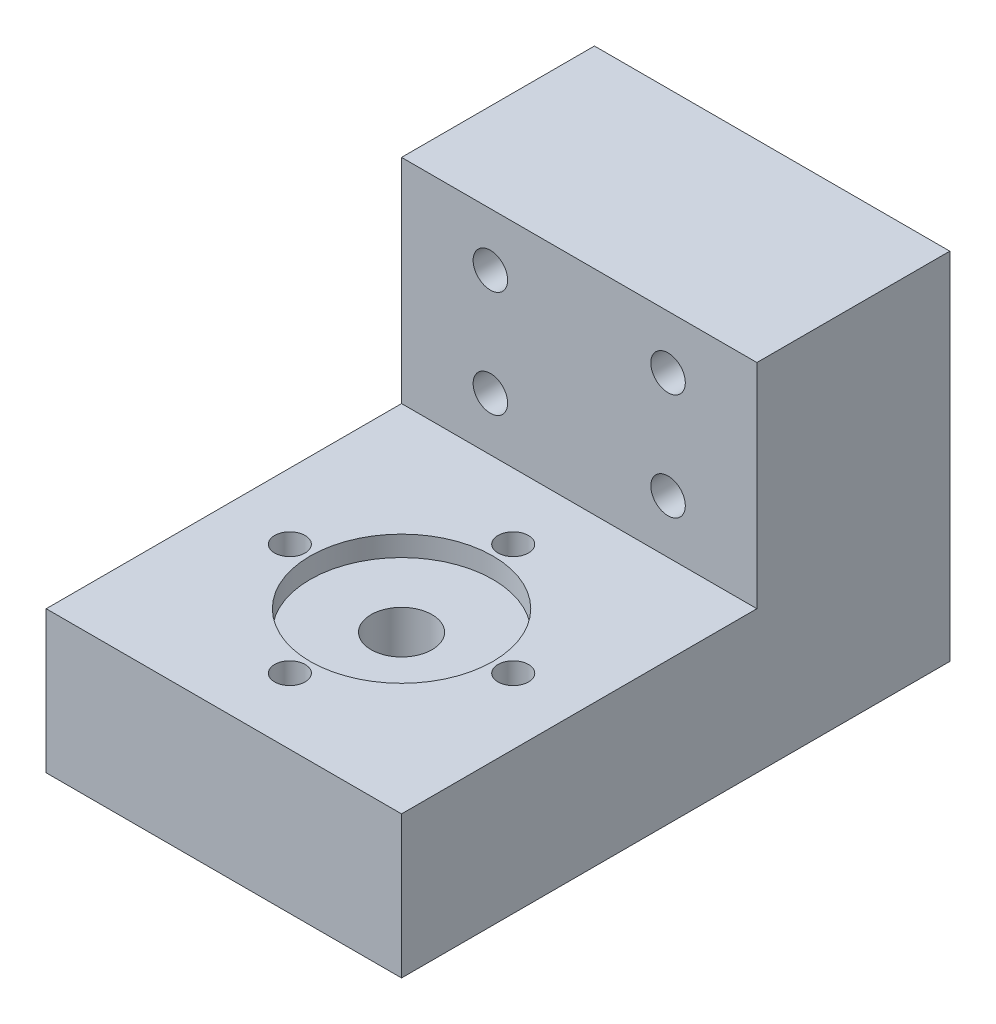
ISO-10303-21;
HEADER;
FILE_DESCRIPTION(('STEP AP214'),'2;1');
FILE_NAME('part.step','',(''),(''),'','','');
FILE_SCHEMA(('AUTOMOTIVE_DESIGN { 1 0 10303 214 1 1 1 1 }'));
ENDSEC;
DATA;
#1=APPLICATION_CONTEXT('core data for automotive mechanical design processes');
#2=APPLICATION_PROTOCOL_DEFINITION('international standard','automotive_design',2000,#1);
#3=PRODUCT_CONTEXT('',#1,'mechanical');
#4=PRODUCT('Part','Part','',(#3));
#5=PRODUCT_RELATED_PRODUCT_CATEGORY('part','',(#4));
#6=PRODUCT_DEFINITION_FORMATION('','',#4);
#7=PRODUCT_DEFINITION_CONTEXT('part definition',#1,'design');
#8=PRODUCT_DEFINITION('design','',#6,#7);
#9=PRODUCT_DEFINITION_SHAPE('','',#8);
#10=(LENGTH_UNIT() NAMED_UNIT(*) SI_UNIT(.MILLI.,.METRE.));
#11=(NAMED_UNIT(*) PLANE_ANGLE_UNIT() SI_UNIT($,.RADIAN.));
#12=(NAMED_UNIT(*) SI_UNIT($,.STERADIAN.) SOLID_ANGLE_UNIT());
#13=UNCERTAINTY_MEASURE_WITH_UNIT(LENGTH_MEASURE(1.E-05),#10,'distance_accuracy_value','');
#14=(GEOMETRIC_REPRESENTATION_CONTEXT(3) GLOBAL_UNCERTAINTY_ASSIGNED_CONTEXT((#13)) GLOBAL_UNIT_ASSIGNED_CONTEXT((#10,
#11,#12)) REPRESENTATION_CONTEXT('',''));
#15=CARTESIAN_POINT('',(0.,0.,0.));
#16=DIRECTION('',(0.,0.,1.));
#17=DIRECTION('',(1.,0.,0.));
#18=AXIS2_PLACEMENT_3D('',#15,#16,#17);
#19=CARTESIAN_POINT('',(17.5,0.,36.5));
#20=DIRECTION('',(0.,1.,0.));
#21=DIRECTION('',(0.,0.,1.));
#22=AXIS2_PLACEMENT_3D('',#19,#20,#21);
#23=CYLINDRICAL_SURFACE('',#22,3.);
#24=CARTESIAN_POINT('',(17.5,0.,36.5));
#25=DIRECTION('',(0.,1.,0.));
#26=DIRECTION('',(0.,0.,1.));
#27=AXIS2_PLACEMENT_3D('',#24,#25,#26);
#28=CIRCLE('',#27,3.);
#29=CARTESIAN_POINT('',(17.5,0.,39.5));
#30=VERTEX_POINT('',#29);
#31=EDGE_CURVE('E134',#30,#30,#28,.T.);
#32=ORIENTED_EDGE('',*,*,#31,.F.);
#33=EDGE_LOOP('',(#32));
#34=FACE_BOUND('',#33,.T.);
#35=CARTESIAN_POINT('',(17.5,12.,36.5));
#36=DIRECTION('',(0.,1.,0.));
#37=DIRECTION('',(0.,0.,1.));
#38=AXIS2_PLACEMENT_3D('',#35,#36,#37);
#39=CIRCLE('',#38,3.);
#40=CARTESIAN_POINT('',(17.5,12.,39.5));
#41=VERTEX_POINT('',#40);
#42=EDGE_CURVE('E49',#41,#41,#39,.F.);
#43=ORIENTED_EDGE('',*,*,#42,.F.);
#44=EDGE_LOOP('',(#43));
#45=FACE_BOUND('',#44,.T.);
#46=ADVANCED_FACE('F45',(#34,#45),#23,.F.);
#47=CARTESIAN_POINT('',(0.,0.,19.));
#48=DIRECTION('',(0.,0.,-1.));
#49=DIRECTION('',(-1.,0.,0.));
#50=AXIS2_PLACEMENT_3D('',#47,#48,#49);
#51=PLANE('',#50);
#52=CARTESIAN_POINT('',(26.25,29.75,19.));
#53=DIRECTION('',(0.,0.,1.));
#54=DIRECTION('',(1.,0.,0.));
#55=AXIS2_PLACEMENT_3D('',#52,#53,#54);
#56=CIRCLE('',#55,1.7);
#57=CARTESIAN_POINT('',(27.95,29.75,19.));
#58=VERTEX_POINT('',#57);
#59=EDGE_CURVE('E178',#58,#58,#56,.T.);
#60=ORIENTED_EDGE('',*,*,#59,.F.);
#61=EDGE_LOOP('',(#60));
#62=FACE_BOUND('',#61,.T.);
#63=CARTESIAN_POINT('',(8.75,19.25,19.));
#64=DIRECTION('',(0.,0.,1.));
#65=DIRECTION('',(1.,0.,0.));
#66=AXIS2_PLACEMENT_3D('',#63,#64,#65);
#67=CIRCLE('',#66,1.7);
#68=CARTESIAN_POINT('',(10.45,19.25,19.));
#69=VERTEX_POINT('',#68);
#70=EDGE_CURVE('E184',#69,#69,#67,.T.);
#71=ORIENTED_EDGE('',*,*,#70,.F.);
#72=EDGE_LOOP('',(#71));
#73=FACE_BOUND('',#72,.T.);
#74=CARTESIAN_POINT('',(26.25,19.25,19.));
#75=DIRECTION('',(0.,0.,1.));
#76=DIRECTION('',(1.,0.,0.));
#77=AXIS2_PLACEMENT_3D('',#74,#75,#76);
#78=CIRCLE('',#77,1.7);
#79=CARTESIAN_POINT('',(27.95,19.25,19.));
#80=VERTEX_POINT('',#79);
#81=EDGE_CURVE('E185',#80,#80,#78,.T.);
#82=ORIENTED_EDGE('',*,*,#81,.F.);
#83=EDGE_LOOP('',(#82));
#84=FACE_BOUND('',#83,.T.);
#85=CARTESIAN_POINT('',(8.75,29.75,19.));
#86=DIRECTION('',(0.,0.,1.));
#87=DIRECTION('',(1.,0.,0.));
#88=AXIS2_PLACEMENT_3D('',#85,#86,#87);
#89=CIRCLE('',#88,1.7);
#90=CARTESIAN_POINT('',(10.45,29.75,19.));
#91=VERTEX_POINT('',#90);
#92=EDGE_CURVE('E175',#91,#91,#89,.T.);
#93=ORIENTED_EDGE('',*,*,#92,.F.);
#94=EDGE_LOOP('',(#93));
#95=FACE_BOUND('',#94,.T.);
#96=DIRECTION('',(-1.,0.,0.));
#97=VECTOR('',#96,1.);
#98=CARTESIAN_POINT('',(0.,14.,19.));
#99=LINE('',#98,#97);
#100=CARTESIAN_POINT('',(35.,14.,19.));
#101=VERTEX_POINT('',#100);
#102=CARTESIAN_POINT('',(0.,14.,19.));
#103=VERTEX_POINT('',#102);
#104=EDGE_CURVE('E62',#101,#103,#99,.T.);
#105=ORIENTED_EDGE('',*,*,#104,.F.);
#106=DIRECTION('',(0.,1.,0.));
#107=VECTOR('',#106,1.);
#108=CARTESIAN_POINT('',(35.,0.,19.));
#109=LINE('',#108,#107);
#110=CARTESIAN_POINT('',(35.,35.,19.));
#111=VERTEX_POINT('',#110);
#112=EDGE_CURVE('E67',#101,#111,#109,.T.);
#113=ORIENTED_EDGE('',*,*,#112,.T.);
#114=DIRECTION('',(1.,0.,0.));
#115=VECTOR('',#114,1.);
#116=CARTESIAN_POINT('',(0.,35.,19.));
#117=LINE('',#116,#115);
#118=CARTESIAN_POINT('',(0.,35.,19.));
#119=VERTEX_POINT('',#118);
#120=EDGE_CURVE('E124',#119,#111,#117,.T.);
#121=ORIENTED_EDGE('',*,*,#120,.F.);
#122=DIRECTION('',(0.,1.,0.));
#123=VECTOR('',#122,1.);
#124=CARTESIAN_POINT('',(0.,0.,19.));
#125=LINE('',#124,#123);
#126=EDGE_CURVE('E106',#103,#119,#125,.T.);
#127=ORIENTED_EDGE('',*,*,#126,.F.);
#128=EDGE_LOOP('',(#105,#113,#121,#127));
#129=FACE_BOUND('',#128,.T.);
#130=ADVANCED_FACE('F201',(#62,#73,#84,#95,#129),#51,.F.);
#131=CARTESIAN_POINT('',(0.,0.,19.));
#132=DIRECTION('',(-1.,0.,0.));
#133=DIRECTION('',(0.,0.,1.));
#134=AXIS2_PLACEMENT_3D('',#131,#132,#133);
#135=PLANE('',#134);
#136=DIRECTION('',(0.,1.,0.));
#137=VECTOR('',#136,1.);
#138=CARTESIAN_POINT('',(0.,0.,0.));
#139=LINE('',#138,#137);
#140=CARTESIAN_POINT('',(0.,0.,0.));
#141=VERTEX_POINT('',#140);
#142=CARTESIAN_POINT('',(0.,35.,0.));
#143=VERTEX_POINT('',#142);
#144=EDGE_CURVE('E103',#141,#143,#139,.T.);
#145=ORIENTED_EDGE('',*,*,#144,.F.);
#146=DIRECTION('',(0.,0.,-1.));
#147=VECTOR('',#146,1.);
#148=CARTESIAN_POINT('',(0.,0.,19.));
#149=LINE('',#148,#147);
#150=CARTESIAN_POINT('',(0.,0.,54.));
#151=VERTEX_POINT('',#150);
#152=EDGE_CURVE('E11',#151,#141,#149,.T.);
#153=ORIENTED_EDGE('',*,*,#152,.F.);
#154=DIRECTION('',(0.,-1.,0.));
#155=VECTOR('',#154,1.);
#156=CARTESIAN_POINT('',(0.,0.,54.));
#157=LINE('',#156,#155);
#158=CARTESIAN_POINT('',(0.,14.,54.));
#159=VERTEX_POINT('',#158);
#160=EDGE_CURVE('E133',#159,#151,#157,.T.);
#161=ORIENTED_EDGE('',*,*,#160,.F.);
#162=DIRECTION('',(0.,0.,-1.));
#163=VECTOR('',#162,1.);
#164=CARTESIAN_POINT('',(0.,14.,54.));
#165=LINE('',#164,#163);
#166=EDGE_CURVE('E116',#159,#103,#165,.T.);
#167=ORIENTED_EDGE('',*,*,#166,.T.);
#168=ORIENTED_EDGE('',*,*,#126,.T.);
#169=DIRECTION('',(0.,0.,-1.));
#170=VECTOR('',#169,1.);
#171=CARTESIAN_POINT('',(0.,35.,19.));
#172=LINE('',#171,#170);
#173=EDGE_CURVE('E109',#119,#143,#172,.T.);
#174=ORIENTED_EDGE('',*,*,#173,.T.);
#175=EDGE_LOOP('',(#145,#153,#161,#167,#168,#174));
#176=FACE_BOUND('',#175,.T.);
#177=ADVANCED_FACE('F47',(#176),#135,.T.);
#178=CARTESIAN_POINT('',(0.,0.,19.));
#179=DIRECTION('',(0.,1.,0.));
#180=DIRECTION('',(0.,0.,1.));
#181=AXIS2_PLACEMENT_3D('',#178,#179,#180);
#182=PLANE('',#181);
#183=CARTESIAN_POINT('',(6.5,0.,36.5));
#184=DIRECTION('',(0.,1.,0.));
#185=DIRECTION('',(0.,0.,1.));
#186=AXIS2_PLACEMENT_3D('',#183,#184,#185);
#187=CIRCLE('',#186,1.5);
#188=CARTESIAN_POINT('',(6.5,0.,38.));
#189=VERTEX_POINT('',#188);
#190=EDGE_CURVE('E148',#189,#189,#187,.T.);
#191=ORIENTED_EDGE('',*,*,#190,.T.);
#192=EDGE_LOOP('',(#191));
#193=FACE_BOUND('',#192,.T.);
#194=CARTESIAN_POINT('',(17.5,0.,25.5));
#195=DIRECTION('',(0.,1.,0.));
#196=DIRECTION('',(0.,0.,1.));
#197=AXIS2_PLACEMENT_3D('',#194,#195,#196);
#198=CIRCLE('',#197,1.5);
#199=CARTESIAN_POINT('',(17.5,0.,27.));
#200=VERTEX_POINT('',#199);
#201=EDGE_CURVE('E164',#200,#200,#198,.T.);
#202=ORIENTED_EDGE('',*,*,#201,.T.);
#203=EDGE_LOOP('',(#202));
#204=FACE_BOUND('',#203,.T.);
#205=CARTESIAN_POINT('',(28.5,0.,36.5));
#206=DIRECTION('',(0.,1.,0.));
#207=DIRECTION('',(0.,0.,1.));
#208=AXIS2_PLACEMENT_3D('',#205,#206,#207);
#209=CIRCLE('',#208,1.5);
#210=CARTESIAN_POINT('',(28.5,0.,38.));
#211=VERTEX_POINT('',#210);
#212=EDGE_CURVE('E158',#211,#211,#209,.T.);
#213=ORIENTED_EDGE('',*,*,#212,.T.);
#214=EDGE_LOOP('',(#213));
#215=FACE_BOUND('',#214,.T.);
#216=CARTESIAN_POINT('',(17.5,0.,47.5));
#217=DIRECTION('',(0.,1.,0.));
#218=DIRECTION('',(0.,0.,1.));
#219=AXIS2_PLACEMENT_3D('',#216,#217,#218);
#220=CIRCLE('',#219,1.5);
#221=CARTESIAN_POINT('',(17.5,0.,49.));
#222=VERTEX_POINT('',#221);
#223=EDGE_CURVE('E151',#222,#222,#220,.T.);
#224=ORIENTED_EDGE('',*,*,#223,.T.);
#225=EDGE_LOOP('',(#224));
#226=FACE_BOUND('',#225,.T.);
#227=ORIENTED_EDGE('',*,*,#31,.T.);
#228=EDGE_LOOP('',(#227));
#229=FACE_BOUND('',#228,.T.);
#230=DIRECTION('',(1.,0.,0.));
#231=VECTOR('',#230,1.);
#232=CARTESIAN_POINT('',(0.,0.,0.));
#233=LINE('',#232,#231);
#234=CARTESIAN_POINT('',(35.,0.,0.));
#235=VERTEX_POINT('',#234);
#236=EDGE_CURVE('E89',#141,#235,#233,.T.);
#237=ORIENTED_EDGE('',*,*,#236,.T.);
#238=DIRECTION('',(0.,0.,-1.));
#239=VECTOR('',#238,1.);
#240=CARTESIAN_POINT('',(35.,0.,19.));
#241=LINE('',#240,#239);
#242=CARTESIAN_POINT('',(35.,0.,54.));
#243=VERTEX_POINT('',#242);
#244=EDGE_CURVE('E54',#243,#235,#241,.T.);
#245=ORIENTED_EDGE('',*,*,#244,.F.);
#246=DIRECTION('',(1.,0.,0.));
#247=VECTOR('',#246,1.);
#248=CARTESIAN_POINT('',(0.,0.,54.));
#249=LINE('',#248,#247);
#250=EDGE_CURVE('E93',#151,#243,#249,.T.);
#251=ORIENTED_EDGE('',*,*,#250,.F.);
#252=ORIENTED_EDGE('',*,*,#152,.T.);
#253=EDGE_LOOP('',(#237,#245,#251,#252));
#254=FACE_BOUND('',#253,.T.);
#255=ADVANCED_FACE('F87',(#193,#204,#215,#226,#229,#254),#182,.F.);
#256=CARTESIAN_POINT('',(35.,0.,19.));
#257=DIRECTION('',(-1.,0.,0.));
#258=DIRECTION('',(0.,0.,1.));
#259=AXIS2_PLACEMENT_3D('',#256,#257,#258);
#260=PLANE('',#259);
#261=DIRECTION('',(0.,1.,0.));
#262=VECTOR('',#261,1.);
#263=CARTESIAN_POINT('',(35.,0.,0.));
#264=LINE('',#263,#262);
#265=CARTESIAN_POINT('',(35.,35.,0.));
#266=VERTEX_POINT('',#265);
#267=EDGE_CURVE('E105',#235,#266,#264,.T.);
#268=ORIENTED_EDGE('',*,*,#267,.T.);
#269=DIRECTION('',(0.,0.,-1.));
#270=VECTOR('',#269,1.);
#271=CARTESIAN_POINT('',(35.,35.,19.));
#272=LINE('',#271,#270);
#273=EDGE_CURVE('E123',#111,#266,#272,.T.);
#274=ORIENTED_EDGE('',*,*,#273,.F.);
#275=ORIENTED_EDGE('',*,*,#112,.F.);
#276=DIRECTION('',(0.,0.,-1.));
#277=VECTOR('',#276,1.);
#278=CARTESIAN_POINT('',(35.,14.,54.));
#279=LINE('',#278,#277);
#280=CARTESIAN_POINT('',(35.,14.,54.));
#281=VERTEX_POINT('',#280);
#282=EDGE_CURVE('E112',#281,#101,#279,.T.);
#283=ORIENTED_EDGE('',*,*,#282,.F.);
#284=DIRECTION('',(0.,1.,0.));
#285=VECTOR('',#284,1.);
#286=CARTESIAN_POINT('',(35.,0.,54.));
#287=LINE('',#286,#285);
#288=EDGE_CURVE('E137',#243,#281,#287,.T.);
#289=ORIENTED_EDGE('',*,*,#288,.F.);
#290=ORIENTED_EDGE('',*,*,#244,.T.);
#291=EDGE_LOOP('',(#268,#274,#275,#283,#289,#290));
#292=FACE_BOUND('',#291,.T.);
#293=ADVANCED_FACE('F252',(#292),#260,.F.);
#294=CARTESIAN_POINT('',(0.,35.,19.));
#295=DIRECTION('',(0.,1.,0.));
#296=DIRECTION('',(0.,0.,1.));
#297=AXIS2_PLACEMENT_3D('',#294,#295,#296);
#298=PLANE('',#297);
#299=DIRECTION('',(1.,0.,0.));
#300=VECTOR('',#299,1.);
#301=CARTESIAN_POINT('',(0.,35.,0.));
#302=LINE('',#301,#300);
#303=EDGE_CURVE('E111',#143,#266,#302,.T.);
#304=ORIENTED_EDGE('',*,*,#303,.F.);
#305=ORIENTED_EDGE('',*,*,#173,.F.);
#306=ORIENTED_EDGE('',*,*,#120,.T.);
#307=ORIENTED_EDGE('',*,*,#273,.T.);
#308=EDGE_LOOP('',(#304,#305,#306,#307));
#309=FACE_BOUND('',#308,.T.);
#310=ADVANCED_FACE('F248',(#309),#298,.T.);
#311=CARTESIAN_POINT('',(0.,0.,0.));
#312=DIRECTION('',(0.,0.,-1.));
#313=DIRECTION('',(-1.,0.,0.));
#314=AXIS2_PLACEMENT_3D('',#311,#312,#313);
#315=PLANE('',#314);
#316=CARTESIAN_POINT('',(26.25,29.75,0.));
#317=DIRECTION('',(0.,0.,1.));
#318=DIRECTION('',(1.,0.,0.));
#319=AXIS2_PLACEMENT_3D('',#316,#317,#318);
#320=CIRCLE('',#319,1.7);
#321=CARTESIAN_POINT('',(27.95,29.75,0.));
#322=VERTEX_POINT('',#321);
#323=EDGE_CURVE('E188',#322,#322,#320,.T.);
#324=ORIENTED_EDGE('',*,*,#323,.T.);
#325=EDGE_LOOP('',(#324));
#326=FACE_BOUND('',#325,.T.);
#327=CARTESIAN_POINT('',(8.75,19.25,0.));
#328=DIRECTION('',(0.,0.,1.));
#329=DIRECTION('',(1.,0.,0.));
#330=AXIS2_PLACEMENT_3D('',#327,#328,#329);
#331=CIRCLE('',#330,1.7);
#332=CARTESIAN_POINT('',(10.45,19.25,0.));
#333=VERTEX_POINT('',#332);
#334=EDGE_CURVE('E181',#333,#333,#331,.T.);
#335=ORIENTED_EDGE('',*,*,#334,.T.);
#336=EDGE_LOOP('',(#335));
#337=FACE_BOUND('',#336,.T.);
#338=CARTESIAN_POINT('',(26.25,19.25,0.));
#339=DIRECTION('',(0.,0.,1.));
#340=DIRECTION('',(1.,0.,0.));
#341=AXIS2_PLACEMENT_3D('',#338,#339,#340);
#342=CIRCLE('',#341,1.7);
#343=CARTESIAN_POINT('',(27.95,19.25,0.));
#344=VERTEX_POINT('',#343);
#345=EDGE_CURVE('E193',#344,#344,#342,.T.);
#346=ORIENTED_EDGE('',*,*,#345,.T.);
#347=EDGE_LOOP('',(#346));
#348=FACE_BOUND('',#347,.T.);
#349=CARTESIAN_POINT('',(8.75,29.75,0.));
#350=DIRECTION('',(0.,0.,1.));
#351=DIRECTION('',(1.,0.,0.));
#352=AXIS2_PLACEMENT_3D('',#349,#350,#351);
#353=CIRCLE('',#352,1.7);
#354=CARTESIAN_POINT('',(10.45,29.75,0.));
#355=VERTEX_POINT('',#354);
#356=EDGE_CURVE('E155',#355,#355,#353,.T.);
#357=ORIENTED_EDGE('',*,*,#356,.T.);
#358=EDGE_LOOP('',(#357));
#359=FACE_BOUND('',#358,.T.);
#360=ORIENTED_EDGE('',*,*,#144,.T.);
#361=ORIENTED_EDGE('',*,*,#303,.T.);
#362=ORIENTED_EDGE('',*,*,#267,.F.);
#363=ORIENTED_EDGE('',*,*,#236,.F.);
#364=EDGE_LOOP('',(#360,#361,#362,#363));
#365=FACE_BOUND('',#364,.T.);
#366=ADVANCED_FACE('F101',(#326,#337,#348,#359,#365),#315,.T.);
#367=CARTESIAN_POINT('',(0.,14.,54.));
#368=DIRECTION('',(0.,-1.,0.));
#369=DIRECTION('',(0.,0.,-1.));
#370=AXIS2_PLACEMENT_3D('',#367,#368,#369);
#371=PLANE('',#370);
#372=CARTESIAN_POINT('',(6.5,14.,36.5));
#373=DIRECTION('',(0.,1.,0.));
#374=DIRECTION('',(0.,0.,1.));
#375=AXIS2_PLACEMENT_3D('',#372,#373,#374);
#376=CIRCLE('',#375,1.5);
#377=CARTESIAN_POINT('',(6.5,14.,38.));
#378=VERTEX_POINT('',#377);
#379=EDGE_CURVE('E170',#378,#378,#376,.T.);
#380=ORIENTED_EDGE('',*,*,#379,.F.);
#381=EDGE_LOOP('',(#380));
#382=FACE_BOUND('',#381,.T.);
#383=CARTESIAN_POINT('',(17.5,14.,25.5));
#384=DIRECTION('',(0.,1.,0.));
#385=DIRECTION('',(0.,0.,1.));
#386=AXIS2_PLACEMENT_3D('',#383,#384,#385);
#387=CIRCLE('',#386,1.5);
#388=CARTESIAN_POINT('',(17.5,14.,27.));
#389=VERTEX_POINT('',#388);
#390=EDGE_CURVE('E167',#389,#389,#387,.T.);
#391=ORIENTED_EDGE('',*,*,#390,.F.);
#392=EDGE_LOOP('',(#391));
#393=FACE_BOUND('',#392,.T.);
#394=CARTESIAN_POINT('',(28.5,14.,36.5));
#395=DIRECTION('',(0.,1.,0.));
#396=DIRECTION('',(0.,0.,1.));
#397=AXIS2_PLACEMENT_3D('',#394,#395,#396);
#398=CIRCLE('',#397,1.5);
#399=CARTESIAN_POINT('',(28.5,14.,38.));
#400=VERTEX_POINT('',#399);
#401=EDGE_CURVE('E161',#400,#400,#398,.T.);
#402=ORIENTED_EDGE('',*,*,#401,.F.);
#403=EDGE_LOOP('',(#402));
#404=FACE_BOUND('',#403,.T.);
#405=CARTESIAN_POINT('',(17.5,14.,47.5));
#406=DIRECTION('',(0.,1.,0.));
#407=DIRECTION('',(0.,0.,1.));
#408=AXIS2_PLACEMENT_3D('',#405,#406,#407);
#409=CIRCLE('',#408,1.5);
#410=CARTESIAN_POINT('',(17.5,14.,49.));
#411=VERTEX_POINT('',#410);
#412=EDGE_CURVE('E154',#411,#411,#409,.T.);
#413=ORIENTED_EDGE('',*,*,#412,.F.);
#414=EDGE_LOOP('',(#413));
#415=FACE_BOUND('',#414,.T.);
#416=CARTESIAN_POINT('',(17.5,14.,36.5));
#417=DIRECTION('',(0.,1.,0.));
#418=DIRECTION('',(0.,0.,1.));
#419=AXIS2_PLACEMENT_3D('',#416,#417,#418);
#420=CIRCLE('',#419,9.);
#421=CARTESIAN_POINT('',(17.5,14.,45.5));
#422=VERTEX_POINT('',#421);
#423=EDGE_CURVE('E144',#422,#422,#420,.T.);
#424=ORIENTED_EDGE('',*,*,#423,.F.);
#425=EDGE_LOOP('',(#424));
#426=FACE_BOUND('',#425,.T.);
#427=ORIENTED_EDGE('',*,*,#104,.T.);
#428=ORIENTED_EDGE('',*,*,#166,.F.);
#429=DIRECTION('',(-1.,0.,0.));
#430=VECTOR('',#429,1.);
#431=CARTESIAN_POINT('',(0.,14.,54.));
#432=LINE('',#431,#430);
#433=EDGE_CURVE('E131',#281,#159,#432,.T.);
#434=ORIENTED_EDGE('',*,*,#433,.F.);
#435=ORIENTED_EDGE('',*,*,#282,.T.);
#436=EDGE_LOOP('',(#427,#428,#434,#435));
#437=FACE_BOUND('',#436,.T.);
#438=ADVANCED_FACE('F242',(#382,#393,#404,#415,#426,#437),#371,.F.);
#439=CARTESIAN_POINT('',(0.,0.,54.));
#440=DIRECTION('',(0.,0.,-1.));
#441=DIRECTION('',(-1.,0.,0.));
#442=AXIS2_PLACEMENT_3D('',#439,#440,#441);
#443=PLANE('',#442);
#444=ORIENTED_EDGE('',*,*,#160,.T.);
#445=ORIENTED_EDGE('',*,*,#250,.T.);
#446=ORIENTED_EDGE('',*,*,#288,.T.);
#447=ORIENTED_EDGE('',*,*,#433,.T.);
#448=EDGE_LOOP('',(#444,#445,#446,#447));
#449=FACE_BOUND('',#448,.T.);
#450=ADVANCED_FACE('F239',(#449),#443,.F.);
#451=CARTESIAN_POINT('',(17.5,12.,36.5));
#452=DIRECTION('',(0.,1.,0.));
#453=DIRECTION('',(0.,0.,1.));
#454=AXIS2_PLACEMENT_3D('',#451,#452,#453);
#455=PLANE('',#454);
#456=CARTESIAN_POINT('',(17.5,12.,36.5));
#457=DIRECTION('',(0.,1.,0.));
#458=DIRECTION('',(0.,0.,1.));
#459=AXIS2_PLACEMENT_3D('',#456,#457,#458);
#460=CIRCLE('',#459,9.);
#461=CARTESIAN_POINT('',(17.5,12.,45.5));
#462=VERTEX_POINT('',#461);
#463=EDGE_CURVE('E147',#462,#462,#460,.T.);
#464=ORIENTED_EDGE('',*,*,#463,.T.);
#465=EDGE_LOOP('',(#464));
#466=FACE_BOUND('',#465,.T.);
#467=ORIENTED_EDGE('',*,*,#42,.T.);
#468=EDGE_LOOP('',(#467));
#469=FACE_BOUND('',#468,.T.);
#470=ADVANCED_FACE('F241',(#466,#469),#455,.T.);
#471=CARTESIAN_POINT('',(17.5,12.,36.5));
#472=DIRECTION('',(0.,1.,0.));
#473=DIRECTION('',(0.,0.,1.));
#474=AXIS2_PLACEMENT_3D('',#471,#472,#473);
#475=CYLINDRICAL_SURFACE('',#474,9.);
#476=ORIENTED_EDGE('',*,*,#463,.F.);
#477=EDGE_LOOP('',(#476));
#478=FACE_BOUND('',#477,.T.);
#479=ORIENTED_EDGE('',*,*,#423,.T.);
#480=EDGE_LOOP('',(#479));
#481=FACE_BOUND('',#480,.T.);
#482=ADVANCED_FACE('F237',(#478,#481),#475,.F.);
#483=CARTESIAN_POINT('',(17.5,0.,47.5));
#484=DIRECTION('',(0.,1.,0.));
#485=DIRECTION('',(0.,0.,1.));
#486=AXIS2_PLACEMENT_3D('',#483,#484,#485);
#487=CYLINDRICAL_SURFACE('',#486,1.5);
#488=ORIENTED_EDGE('',*,*,#223,.F.);
#489=EDGE_LOOP('',(#488));
#490=FACE_BOUND('',#489,.T.);
#491=ORIENTED_EDGE('',*,*,#412,.T.);
#492=EDGE_LOOP('',(#491));
#493=FACE_BOUND('',#492,.T.);
#494=ADVANCED_FACE('F315',(#490,#493),#487,.F.);
#495=CARTESIAN_POINT('',(28.5,0.,36.5));
#496=DIRECTION('',(0.,1.,0.));
#497=DIRECTION('',(0.,0.,1.));
#498=AXIS2_PLACEMENT_3D('',#495,#496,#497);
#499=CYLINDRICAL_SURFACE('',#498,1.5);
#500=ORIENTED_EDGE('',*,*,#212,.F.);
#501=EDGE_LOOP('',(#500));
#502=FACE_BOUND('',#501,.T.);
#503=ORIENTED_EDGE('',*,*,#401,.T.);
#504=EDGE_LOOP('',(#503));
#505=FACE_BOUND('',#504,.T.);
#506=ADVANCED_FACE('F324',(#502,#505),#499,.F.);
#507=CARTESIAN_POINT('',(17.5,0.,25.5));
#508=DIRECTION('',(0.,1.,0.));
#509=DIRECTION('',(0.,0.,1.));
#510=AXIS2_PLACEMENT_3D('',#507,#508,#509);
#511=CYLINDRICAL_SURFACE('',#510,1.5);
#512=ORIENTED_EDGE('',*,*,#201,.F.);
#513=EDGE_LOOP('',(#512));
#514=FACE_BOUND('',#513,.T.);
#515=ORIENTED_EDGE('',*,*,#390,.T.);
#516=EDGE_LOOP('',(#515));
#517=FACE_BOUND('',#516,.T.);
#518=ADVANCED_FACE('F221',(#514,#517),#511,.F.);
#519=CARTESIAN_POINT('',(6.5,0.,36.5));
#520=DIRECTION('',(0.,1.,0.));
#521=DIRECTION('',(0.,0.,1.));
#522=AXIS2_PLACEMENT_3D('',#519,#520,#521);
#523=CYLINDRICAL_SURFACE('',#522,1.5);
#524=ORIENTED_EDGE('',*,*,#190,.F.);
#525=EDGE_LOOP('',(#524));
#526=FACE_BOUND('',#525,.T.);
#527=ORIENTED_EDGE('',*,*,#379,.T.);
#528=EDGE_LOOP('',(#527));
#529=FACE_BOUND('',#528,.T.);
#530=ADVANCED_FACE('F210',(#526,#529),#523,.F.);
#531=CARTESIAN_POINT('',(8.75,29.75,0.));
#532=DIRECTION('',(0.,0.,1.));
#533=DIRECTION('',(1.,0.,0.));
#534=AXIS2_PLACEMENT_3D('',#531,#532,#533);
#535=CYLINDRICAL_SURFACE('',#534,1.7);
#536=ORIENTED_EDGE('',*,*,#356,.F.);
#537=EDGE_LOOP('',(#536));
#538=FACE_BOUND('',#537,.T.);
#539=ORIENTED_EDGE('',*,*,#92,.T.);
#540=EDGE_LOOP('',(#539));
#541=FACE_BOUND('',#540,.T.);
#542=ADVANCED_FACE('F208',(#538,#541),#535,.F.);
#543=CARTESIAN_POINT('',(26.25,19.25,0.));
#544=DIRECTION('',(0.,0.,1.));
#545=DIRECTION('',(1.,0.,0.));
#546=AXIS2_PLACEMENT_3D('',#543,#544,#545);
#547=CYLINDRICAL_SURFACE('',#546,1.7);
#548=ORIENTED_EDGE('',*,*,#345,.F.);
#549=EDGE_LOOP('',(#548));
#550=FACE_BOUND('',#549,.T.);
#551=ORIENTED_EDGE('',*,*,#81,.T.);
#552=EDGE_LOOP('',(#551));
#553=FACE_BOUND('',#552,.T.);
#554=ADVANCED_FACE('F199',(#550,#553),#547,.F.);
#555=CARTESIAN_POINT('',(8.75,19.25,0.));
#556=DIRECTION('',(0.,0.,1.));
#557=DIRECTION('',(1.,0.,0.));
#558=AXIS2_PLACEMENT_3D('',#555,#556,#557);
#559=CYLINDRICAL_SURFACE('',#558,1.7);
#560=ORIENTED_EDGE('',*,*,#334,.F.);
#561=EDGE_LOOP('',(#560));
#562=FACE_BOUND('',#561,.T.);
#563=ORIENTED_EDGE('',*,*,#70,.T.);
#564=EDGE_LOOP('',(#563));
#565=FACE_BOUND('',#564,.T.);
#566=ADVANCED_FACE('F217',(#562,#565),#559,.F.);
#567=CARTESIAN_POINT('',(26.25,29.75,0.));
#568=DIRECTION('',(0.,0.,1.));
#569=DIRECTION('',(1.,0.,0.));
#570=AXIS2_PLACEMENT_3D('',#567,#568,#569);
#571=CYLINDRICAL_SURFACE('',#570,1.7);
#572=ORIENTED_EDGE('',*,*,#323,.F.);
#573=EDGE_LOOP('',(#572));
#574=FACE_BOUND('',#573,.T.);
#575=ORIENTED_EDGE('',*,*,#59,.T.);
#576=EDGE_LOOP('',(#575));
#577=FACE_BOUND('',#576,.T.);
#578=ADVANCED_FACE('F368',(#574,#577),#571,.F.);
#579=CLOSED_SHELL('',(#46,#130,#177,#255,#293,#310,#366,#438,#450,#470,#482,#494,#506,#518,#530,
#542,#554,#566,#578));
#580=MANIFOLD_SOLID_BREP('B2',#579);
#581=ADVANCED_BREP_SHAPE_REPRESENTATION('',(#18,#580),#14);
#582=SHAPE_DEFINITION_REPRESENTATION(#9,#581);
ENDSEC;
END-ISO-10303-21;
